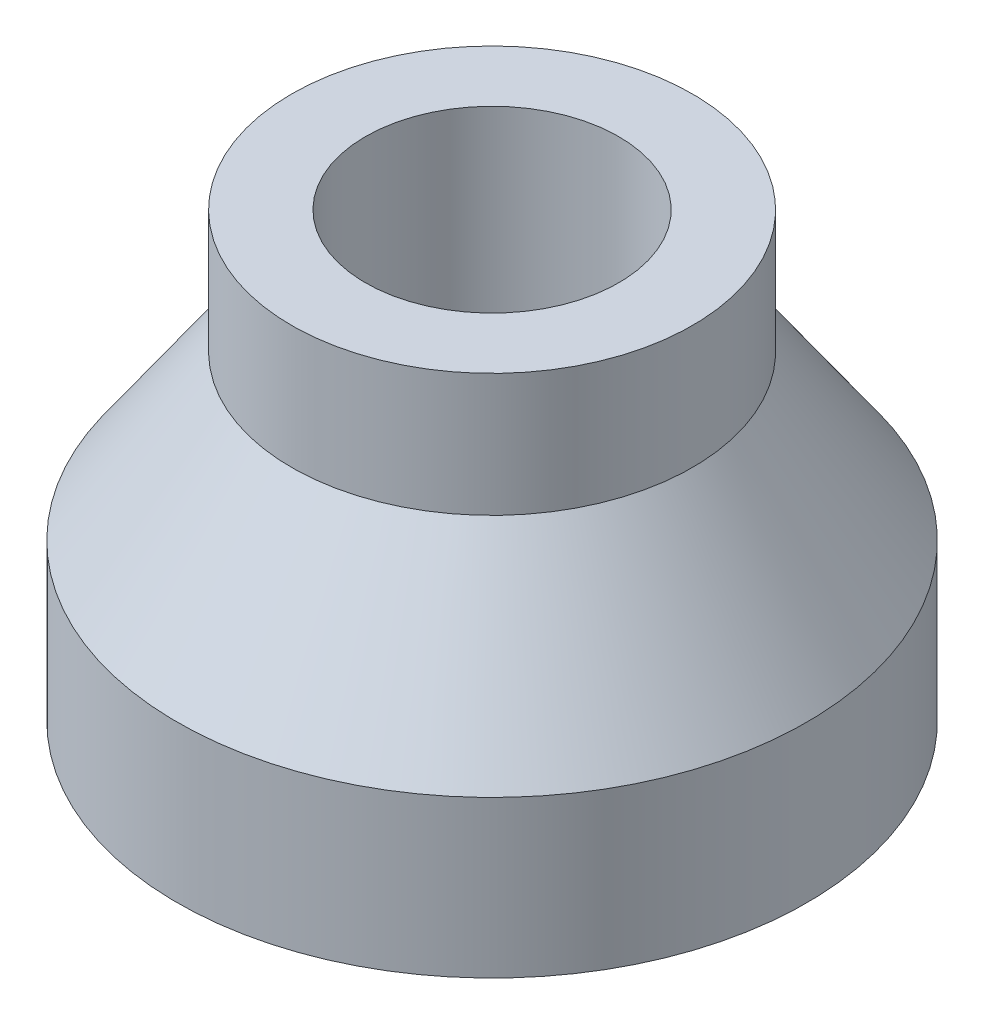
ISO-10303-21;
HEADER;
FILE_DESCRIPTION(('STEP AP214'),'2;1');
FILE_NAME('part.step','',(''),(''),'','','');
FILE_SCHEMA(('AUTOMOTIVE_DESIGN { 1 0 10303 214 1 1 1 1 }'));
ENDSEC;
DATA;
#1=APPLICATION_CONTEXT('core data for automotive mechanical design processes');
#2=APPLICATION_PROTOCOL_DEFINITION('international standard','automotive_design',2000,#1);
#3=PRODUCT_CONTEXT('',#1,'mechanical');
#4=PRODUCT('Part','Part','',(#3));
#5=PRODUCT_RELATED_PRODUCT_CATEGORY('part','',(#4));
#6=PRODUCT_DEFINITION_FORMATION('','',#4);
#7=PRODUCT_DEFINITION_CONTEXT('part definition',#1,'design');
#8=PRODUCT_DEFINITION('design','',#6,#7);
#9=PRODUCT_DEFINITION_SHAPE('','',#8);
#10=(LENGTH_UNIT() NAMED_UNIT(*) SI_UNIT(.MILLI.,.METRE.));
#11=(NAMED_UNIT(*) PLANE_ANGLE_UNIT() SI_UNIT($,.RADIAN.));
#12=(NAMED_UNIT(*) SI_UNIT($,.STERADIAN.) SOLID_ANGLE_UNIT());
#13=UNCERTAINTY_MEASURE_WITH_UNIT(LENGTH_MEASURE(1.E-05),#10,'distance_accuracy_value','');
#14=(GEOMETRIC_REPRESENTATION_CONTEXT(3) GLOBAL_UNCERTAINTY_ASSIGNED_CONTEXT((#13)) GLOBAL_UNIT_ASSIGNED_CONTEXT((#10,
#11,#12)) REPRESENTATION_CONTEXT('',''));
#15=CARTESIAN_POINT('',(0.,0.,0.));
#16=DIRECTION('',(0.,0.,1.));
#17=DIRECTION('',(1.,0.,0.));
#18=AXIS2_PLACEMENT_3D('',#15,#16,#17);
#19=CARTESIAN_POINT('',(-10.,-0.125632633088874,0.));
#20=DIRECTION('',(0.,1.,0.));
#21=DIRECTION('',(-1.,0.,0.));
#22=AXIS2_PLACEMENT_3D('',#19,#20,#21);
#23=CYLINDRICAL_SURFACE('',#22,2.575);
#24=CARTESIAN_POINT('',(-10.,-21.0097901452199,0.));
#25=DIRECTION('',(0.,1.,0.));
#26=DIRECTION('',(-1.,0.,0.));
#27=AXIS2_PLACEMENT_3D('',#24,#25,#26);
#28=CIRCLE('',#27,2.575);
#29=CARTESIAN_POINT('',(-12.575,-21.0097901452199,0.));
#30=VERTEX_POINT('',#29);
#31=EDGE_CURVE('E10',#30,#30,#28,.T.);
#32=ORIENTED_EDGE('',*,*,#31,.T.);
#33=EDGE_LOOP('',(#32));
#34=FACE_BOUND('',#33,.T.);
#35=CARTESIAN_POINT('',(-10.,-24.8544617263489,0.));
#36=DIRECTION('',(0.,1.,0.));
#37=DIRECTION('',(-1.,0.,0.));
#38=AXIS2_PLACEMENT_3D('',#35,#36,#37);
#39=CIRCLE('',#38,2.575);
#40=CARTESIAN_POINT('',(-12.575,-24.8544617263489,0.));
#41=VERTEX_POINT('',#40);
#42=EDGE_CURVE('E61',#41,#41,#39,.T.);
#43=ORIENTED_EDGE('',*,*,#42,.F.);
#44=EDGE_LOOP('',(#43));
#45=FACE_BOUND('',#44,.T.);
#46=ADVANCED_FACE('F33',(#34,#45),#23,.F.);
#47=CARTESIAN_POINT('',(-12.575,-21.0097901452199,0.));
#48=DIRECTION('',(0.,1.,0.));
#49=DIRECTION('',(-1.,0.,0.));
#50=AXIS2_PLACEMENT_3D('',#47,#48,#49);
#51=PLANE('',#50);
#52=CARTESIAN_POINT('',(-10.,-21.0097901452199,0.));
#53=DIRECTION('',(0.,1.,0.));
#54=DIRECTION('',(-1.,0.,0.));
#55=AXIS2_PLACEMENT_3D('',#52,#53,#54);
#56=CIRCLE('',#55,4.075);
#57=CARTESIAN_POINT('',(-14.075,-21.0097901452199,0.));
#58=VERTEX_POINT('',#57);
#59=EDGE_CURVE('E39',#58,#58,#56,.T.);
#60=ORIENTED_EDGE('',*,*,#59,.T.);
#61=EDGE_LOOP('',(#60));
#62=FACE_BOUND('',#61,.T.);
#63=ORIENTED_EDGE('',*,*,#31,.F.);
#64=EDGE_LOOP('',(#63));
#65=FACE_BOUND('',#64,.T.);
#66=ADVANCED_FACE('F69',(#62,#65),#51,.T.);
#67=CARTESIAN_POINT('',(-10.,-0.125632633088874,0.));
#68=DIRECTION('',(0.,1.,0.));
#69=DIRECTION('',(-1.,0.,0.));
#70=AXIS2_PLACEMENT_3D('',#67,#68,#69);
#71=CYLINDRICAL_SURFACE('',#70,4.075);
#72=CARTESIAN_POINT('',(-10.,-23.5097901452199,0.));
#73=DIRECTION('',(0.,1.,0.));
#74=DIRECTION('',(-1.,0.,0.));
#75=AXIS2_PLACEMENT_3D('',#72,#73,#74);
#76=CIRCLE('',#75,4.075);
#77=CARTESIAN_POINT('',(-14.075,-23.5097901452199,0.));
#78=VERTEX_POINT('',#77);
#79=EDGE_CURVE('E43',#78,#78,#76,.T.);
#80=ORIENTED_EDGE('',*,*,#79,.T.);
#81=EDGE_LOOP('',(#80));
#82=FACE_BOUND('',#81,.T.);
#83=ORIENTED_EDGE('',*,*,#59,.F.);
#84=EDGE_LOOP('',(#83));
#85=FACE_BOUND('',#84,.T.);
#86=ADVANCED_FACE('F73',(#82,#85),#71,.T.);
#87=CARTESIAN_POINT('',(-10.,-23.5097901452199,0.));
#88=DIRECTION('',(0.,-1.,0.));
#89=DIRECTION('',(1.,0.,0.));
#90=AXIS2_PLACEMENT_3D('',#87,#88,#89);
#91=CONICAL_SURFACE('',#90,4.075,0.610865238198016);
#92=CARTESIAN_POINT('',(-10.,-26.8302342608953,0.));
#93=DIRECTION('',(0.,1.,0.));
#94=DIRECTION('',(-1.,0.,0.));
#95=AXIS2_PLACEMENT_3D('',#92,#93,#94);
#96=CIRCLE('',#95,6.4);
#97=CARTESIAN_POINT('',(-16.4,-26.8302342608953,0.));
#98=VERTEX_POINT('',#97);
#99=EDGE_CURVE('E47',#98,#98,#96,.T.);
#100=ORIENTED_EDGE('',*,*,#99,.T.);
#101=EDGE_LOOP('',(#100));
#102=FACE_BOUND('',#101,.T.);
#103=ORIENTED_EDGE('',*,*,#79,.F.);
#104=EDGE_LOOP('',(#103));
#105=FACE_BOUND('',#104,.T.);
#106=ADVANCED_FACE('F77',(#102,#105),#91,.T.);
#107=CARTESIAN_POINT('',(-10.,-0.125632633088874,0.));
#108=DIRECTION('',(0.,1.,0.));
#109=DIRECTION('',(-1.,0.,0.));
#110=AXIS2_PLACEMENT_3D('',#107,#108,#109);
#111=CYLINDRICAL_SURFACE('',#110,6.4);
#112=CARTESIAN_POINT('',(-10.,-30.0097901452199,0.));
#113=DIRECTION('',(0.,1.,0.));
#114=DIRECTION('',(-1.,0.,0.));
#115=AXIS2_PLACEMENT_3D('',#112,#113,#114);
#116=CIRCLE('',#115,6.4);
#117=CARTESIAN_POINT('',(-16.4,-30.0097901452199,0.));
#118=VERTEX_POINT('',#117);
#119=EDGE_CURVE('E52',#118,#118,#116,.T.);
#120=ORIENTED_EDGE('',*,*,#119,.T.);
#121=EDGE_LOOP('',(#120));
#122=FACE_BOUND('',#121,.T.);
#123=ORIENTED_EDGE('',*,*,#99,.F.);
#124=EDGE_LOOP('',(#123));
#125=FACE_BOUND('',#124,.T.);
#126=ADVANCED_FACE('F84',(#122,#125),#111,.T.);
#127=CARTESIAN_POINT('',(-16.4,-30.0097901452199,0.));
#128=DIRECTION('',(0.,-1.,0.));
#129=DIRECTION('',(1.,0.,0.));
#130=AXIS2_PLACEMENT_3D('',#127,#128,#129);
#131=PLANE('',#130);
#132=CARTESIAN_POINT('',(-10.,-30.0097901452199,0.));
#133=DIRECTION('',(0.,1.,0.));
#134=DIRECTION('',(-1.,0.,0.));
#135=AXIS2_PLACEMENT_3D('',#132,#133,#134);
#136=CIRCLE('',#135,4.4);
#137=CARTESIAN_POINT('',(-14.4,-30.0097901452199,0.));
#138=VERTEX_POINT('',#137);
#139=EDGE_CURVE('E55',#138,#138,#136,.T.);
#140=ORIENTED_EDGE('',*,*,#139,.T.);
#141=EDGE_LOOP('',(#140));
#142=FACE_BOUND('',#141,.T.);
#143=ORIENTED_EDGE('',*,*,#119,.F.);
#144=EDGE_LOOP('',(#143));
#145=FACE_BOUND('',#144,.T.);
#146=ADVANCED_FACE('F88',(#142,#145),#131,.T.);
#147=CARTESIAN_POINT('',(-10.,-0.125632633088874,0.));
#148=DIRECTION('',(0.,1.,0.));
#149=DIRECTION('',(-1.,0.,0.));
#150=AXIS2_PLACEMENT_3D('',#147,#148,#149);
#151=CYLINDRICAL_SURFACE('',#150,4.4);
#152=CARTESIAN_POINT('',(-10.,-27.4608318386533,0.));
#153=DIRECTION('',(0.,1.,0.));
#154=DIRECTION('',(-1.,0.,0.));
#155=AXIS2_PLACEMENT_3D('',#152,#153,#154);
#156=CIRCLE('',#155,4.4);
#157=CARTESIAN_POINT('',(-14.4,-27.4608318386533,0.));
#158=VERTEX_POINT('',#157);
#159=EDGE_CURVE('E58',#158,#158,#156,.T.);
#160=ORIENTED_EDGE('',*,*,#159,.T.);
#161=EDGE_LOOP('',(#160));
#162=FACE_BOUND('',#161,.T.);
#163=ORIENTED_EDGE('',*,*,#139,.F.);
#164=EDGE_LOOP('',(#163));
#165=FACE_BOUND('',#164,.T.);
#166=ADVANCED_FACE('F92',(#162,#165),#151,.F.);
#167=CARTESIAN_POINT('',(-10.,-27.4608318386533,0.));
#168=DIRECTION('',(0.,-1.,0.));
#169=DIRECTION('',(1.,0.,0.));
#170=AXIS2_PLACEMENT_3D('',#167,#168,#169);
#171=CONICAL_SURFACE('',#170,4.4,0.610865238198016);
#172=ORIENTED_EDGE('',*,*,#42,.T.);
#173=EDGE_LOOP('',(#172));
#174=FACE_BOUND('',#173,.T.);
#175=ORIENTED_EDGE('',*,*,#159,.F.);
#176=EDGE_LOOP('',(#175));
#177=FACE_BOUND('',#176,.T.);
#178=ADVANCED_FACE('F65',(#174,#177),#171,.F.);
#179=CLOSED_SHELL('',(#46,#66,#86,#106,#126,#146,#166,#178));
#180=MANIFOLD_SOLID_BREP('B2',#179);
#181=ADVANCED_BREP_SHAPE_REPRESENTATION('',(#18,#180),#14);
#182=SHAPE_DEFINITION_REPRESENTATION(#9,#181);
ENDSEC;
END-ISO-10303-21;
